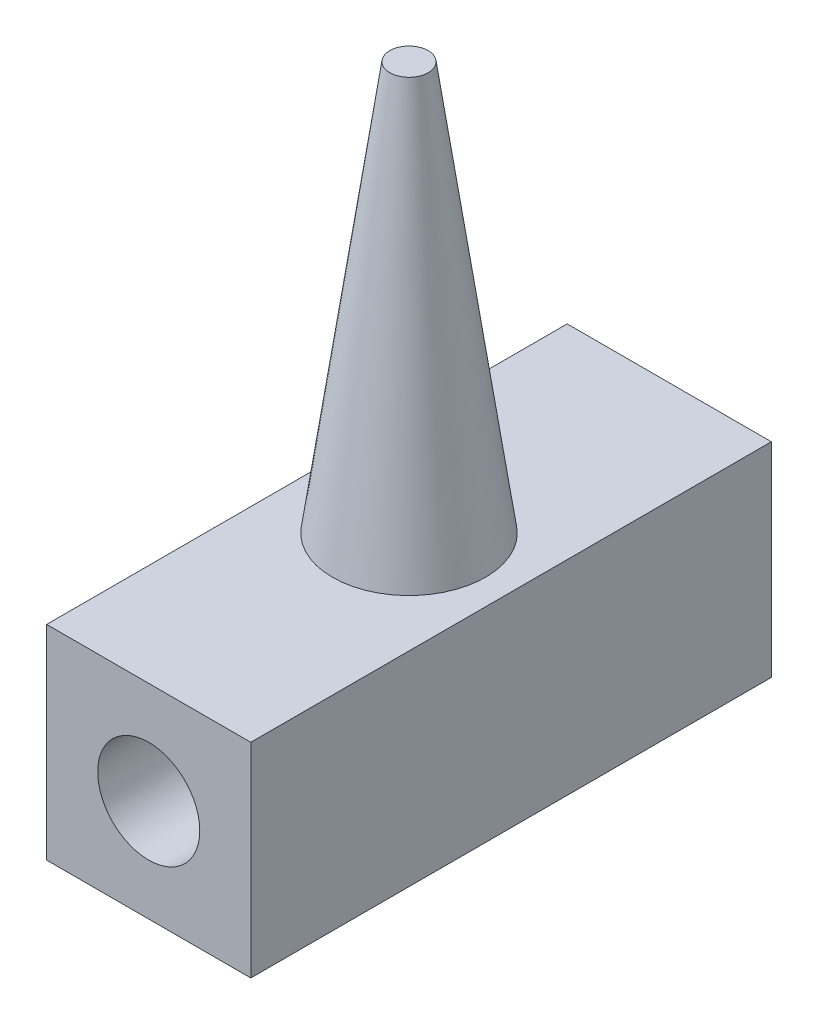
ISO-10303-21;
HEADER;
FILE_DESCRIPTION(('STEP AP214'),'2;1');
FILE_NAME('part.step','',(''),(''),'','','');
FILE_SCHEMA(('AUTOMOTIVE_DESIGN { 1 0 10303 214 1 1 1 1 }'));
ENDSEC;
DATA;
#1=APPLICATION_CONTEXT('core data for automotive mechanical design processes');
#2=APPLICATION_PROTOCOL_DEFINITION('international standard','automotive_design',2000,#1);
#3=PRODUCT_CONTEXT('',#1,'mechanical');
#4=PRODUCT('Part','Part','',(#3));
#5=PRODUCT_RELATED_PRODUCT_CATEGORY('part','',(#4));
#6=PRODUCT_DEFINITION_FORMATION('','',#4);
#7=PRODUCT_DEFINITION_CONTEXT('part definition',#1,'design');
#8=PRODUCT_DEFINITION('design','',#6,#7);
#9=PRODUCT_DEFINITION_SHAPE('','',#8);
#10=(LENGTH_UNIT() NAMED_UNIT(*) SI_UNIT(.MILLI.,.METRE.));
#11=(NAMED_UNIT(*) PLANE_ANGLE_UNIT() SI_UNIT($,.RADIAN.));
#12=(NAMED_UNIT(*) SI_UNIT($,.STERADIAN.) SOLID_ANGLE_UNIT());
#13=UNCERTAINTY_MEASURE_WITH_UNIT(LENGTH_MEASURE(1.E-05),#10,'distance_accuracy_value','');
#14=(GEOMETRIC_REPRESENTATION_CONTEXT(3) GLOBAL_UNCERTAINTY_ASSIGNED_CONTEXT((#13)) GLOBAL_UNIT_ASSIGNED_CONTEXT((#10,
#11,#12)) REPRESENTATION_CONTEXT('',''));
#15=CARTESIAN_POINT('',(0.,0.,0.));
#16=DIRECTION('',(0.,0.,1.));
#17=DIRECTION('',(1.,0.,0.));
#18=AXIS2_PLACEMENT_3D('',#15,#16,#17);
#19=CARTESIAN_POINT('',(-24.75,12.75,51.));
#20=DIRECTION('',(1.,0.,0.));
#21=DIRECTION('',(0.,0.,-1.));
#22=AXIS2_PLACEMENT_3D('',#19,#20,#21);
#23=PLANE('',#22);
#24=DIRECTION('',(0.,-1.,0.));
#25=VECTOR('',#24,1.);
#26=CARTESIAN_POINT('',(-24.75,12.75,0.));
#27=LINE('',#26,#25);
#28=CARTESIAN_POINT('',(-24.75,12.75,0.));
#29=VERTEX_POINT('',#28);
#30=CARTESIAN_POINT('',(-24.75,-7.25000000000001,0.));
#31=VERTEX_POINT('',#30);
#32=EDGE_CURVE('E110',#29,#31,#27,.T.);
#33=ORIENTED_EDGE('',*,*,#32,.T.);
#34=DIRECTION('',(0.,0.,-1.));
#35=VECTOR('',#34,1.);
#36=CARTESIAN_POINT('',(-24.75,-7.25000000000001,51.));
#37=LINE('',#36,#35);
#38=CARTESIAN_POINT('',(-24.75,-7.25000000000001,51.));
#39=VERTEX_POINT('',#38);
#40=EDGE_CURVE('E42',#39,#31,#37,.T.);
#41=ORIENTED_EDGE('',*,*,#40,.F.);
#42=DIRECTION('',(0.,-1.,0.));
#43=VECTOR('',#42,1.);
#44=CARTESIAN_POINT('',(-24.75,12.75,51.));
#45=LINE('',#44,#43);
#46=CARTESIAN_POINT('',(-24.75,12.75,51.));
#47=VERTEX_POINT('',#46);
#48=EDGE_CURVE('E93',#47,#39,#45,.T.);
#49=ORIENTED_EDGE('',*,*,#48,.F.);
#50=DIRECTION('',(0.,0.,-1.));
#51=VECTOR('',#50,1.);
#52=CARTESIAN_POINT('',(-24.75,12.75,51.));
#53=LINE('',#52,#51);
#54=EDGE_CURVE('E106',#47,#29,#53,.T.);
#55=ORIENTED_EDGE('',*,*,#54,.T.);
#56=EDGE_LOOP('',(#33,#41,#49,#55));
#57=FACE_BOUND('',#56,.T.);
#58=ADVANCED_FACE('F39',(#57),#23,.F.);
#59=CARTESIAN_POINT('',(-24.75,-7.25000000000001,51.));
#60=DIRECTION('',(0.,1.,0.));
#61=DIRECTION('',(0.,0.,1.));
#62=AXIS2_PLACEMENT_3D('',#59,#60,#61);
#63=PLANE('',#62);
#64=DIRECTION('',(1.,0.,0.));
#65=VECTOR('',#64,1.);
#66=CARTESIAN_POINT('',(-24.75,-7.25000000000001,0.));
#67=LINE('',#66,#65);
#68=CARTESIAN_POINT('',(-4.74999999999999,-7.25000000000001,0.));
#69=VERTEX_POINT('',#68);
#70=EDGE_CURVE('E99',#31,#69,#67,.T.);
#71=ORIENTED_EDGE('',*,*,#70,.T.);
#72=DIRECTION('',(0.,0.,-1.));
#73=VECTOR('',#72,1.);
#74=CARTESIAN_POINT('',(-4.74999999999999,-7.25000000000001,51.));
#75=LINE('',#74,#73);
#76=CARTESIAN_POINT('',(-4.74999999999999,-7.25000000000001,51.));
#77=VERTEX_POINT('',#76);
#78=EDGE_CURVE('E97',#77,#69,#75,.T.);
#79=ORIENTED_EDGE('',*,*,#78,.F.);
#80=DIRECTION('',(1.,0.,0.));
#81=VECTOR('',#80,1.);
#82=CARTESIAN_POINT('',(-24.75,-7.25000000000001,51.));
#83=LINE('',#82,#81);
#84=EDGE_CURVE('E88',#39,#77,#83,.T.);
#85=ORIENTED_EDGE('',*,*,#84,.F.);
#86=ORIENTED_EDGE('',*,*,#40,.T.);
#87=EDGE_LOOP('',(#71,#79,#85,#86));
#88=FACE_BOUND('',#87,.T.);
#89=ADVANCED_FACE('F98',(#88),#63,.F.);
#90=CARTESIAN_POINT('',(-4.75,12.75,51.));
#91=DIRECTION('',(-1.,0.,0.));
#92=DIRECTION('',(0.,-1.,0.));
#93=AXIS2_PLACEMENT_3D('',#90,#91,#92);
#94=PLANE('',#93);
#95=DIRECTION('',(0.,1.,0.));
#96=VECTOR('',#95,1.);
#97=CARTESIAN_POINT('',(-4.75,12.75,0.));
#98=LINE('',#97,#96);
#99=CARTESIAN_POINT('',(-4.75,12.75,0.));
#100=VERTEX_POINT('',#99);
#101=EDGE_CURVE('E74',#69,#100,#98,.T.);
#102=ORIENTED_EDGE('',*,*,#101,.T.);
#103=DIRECTION('',(0.,0.,-1.));
#104=VECTOR('',#103,1.);
#105=CARTESIAN_POINT('',(-4.75,12.75,51.));
#106=LINE('',#105,#104);
#107=CARTESIAN_POINT('',(-4.75,12.75,51.));
#108=VERTEX_POINT('',#107);
#109=EDGE_CURVE('E101',#108,#100,#106,.T.);
#110=ORIENTED_EDGE('',*,*,#109,.F.);
#111=DIRECTION('',(0.,1.,0.));
#112=VECTOR('',#111,1.);
#113=CARTESIAN_POINT('',(-4.75,12.75,51.));
#114=LINE('',#113,#112);
#115=EDGE_CURVE('E91',#77,#108,#114,.T.);
#116=ORIENTED_EDGE('',*,*,#115,.F.);
#117=ORIENTED_EDGE('',*,*,#78,.T.);
#118=EDGE_LOOP('',(#102,#110,#116,#117));
#119=FACE_BOUND('',#118,.T.);
#120=ADVANCED_FACE('F102',(#119),#94,.F.);
#121=CARTESIAN_POINT('',(-24.75,12.75,51.));
#122=DIRECTION('',(0.,-1.,0.));
#123=DIRECTION('',(0.,0.,-1.));
#124=AXIS2_PLACEMENT_3D('',#121,#122,#123);
#125=PLANE('',#124);
#126=CARTESIAN_POINT('',(-14.75,12.75,25.5));
#127=DIRECTION('',(0.,1.,0.));
#128=DIRECTION('',(0.,0.,1.));
#129=AXIS2_PLACEMENT_3D('',#126,#127,#128);
#130=CIRCLE('',#129,7.5);
#131=CARTESIAN_POINT('',(-14.75,12.75,33.));
#132=VERTEX_POINT('',#131);
#133=EDGE_CURVE('E11',#132,#132,#130,.T.);
#134=ORIENTED_EDGE('',*,*,#133,.F.);
#135=EDGE_LOOP('',(#134));
#136=FACE_BOUND('',#135,.T.);
#137=DIRECTION('',(-1.,0.,0.));
#138=VECTOR('',#137,1.);
#139=CARTESIAN_POINT('',(-24.75,12.75,0.));
#140=LINE('',#139,#138);
#141=EDGE_CURVE('E80',#100,#29,#140,.T.);
#142=ORIENTED_EDGE('',*,*,#141,.T.);
#143=ORIENTED_EDGE('',*,*,#54,.F.);
#144=DIRECTION('',(-1.,0.,0.));
#145=VECTOR('',#144,1.);
#146=CARTESIAN_POINT('',(-24.75,12.75,51.));
#147=LINE('',#146,#145);
#148=EDGE_CURVE('E57',#108,#47,#147,.T.);
#149=ORIENTED_EDGE('',*,*,#148,.F.);
#150=ORIENTED_EDGE('',*,*,#109,.T.);
#151=EDGE_LOOP('',(#142,#143,#149,#150));
#152=FACE_BOUND('',#151,.T.);
#153=ADVANCED_FACE('F124',(#136,#152),#125,.F.);
#154=CARTESIAN_POINT('',(0.,0.,51.));
#155=DIRECTION('',(0.,0.,1.));
#156=DIRECTION('',(1.,0.,0.));
#157=AXIS2_PLACEMENT_3D('',#154,#155,#156);
#158=PLANE('',#157);
#159=CARTESIAN_POINT('',(-14.75,2.74999999999999,51.));
#160=DIRECTION('',(0.,0.,1.));
#161=DIRECTION('',(1.,0.,0.));
#162=AXIS2_PLACEMENT_3D('',#159,#160,#161);
#163=CIRCLE('',#162,5.);
#164=CARTESIAN_POINT('',(-9.74999999999999,2.74999999999999,51.));
#165=VERTEX_POINT('',#164);
#166=EDGE_CURVE('E131',#165,#165,#163,.T.);
#167=ORIENTED_EDGE('',*,*,#166,.F.);
#168=EDGE_LOOP('',(#167));
#169=FACE_BOUND('',#168,.T.);
#170=ORIENTED_EDGE('',*,*,#48,.T.);
#171=ORIENTED_EDGE('',*,*,#84,.T.);
#172=ORIENTED_EDGE('',*,*,#115,.T.);
#173=ORIENTED_EDGE('',*,*,#148,.T.);
#174=EDGE_LOOP('',(#170,#171,#172,#173));
#175=FACE_BOUND('',#174,.T.);
#176=ADVANCED_FACE('F89',(#169,#175),#158,.T.);
#177=CARTESIAN_POINT('',(0.,0.,0.));
#178=DIRECTION('',(0.,0.,1.));
#179=DIRECTION('',(1.,0.,0.));
#180=AXIS2_PLACEMENT_3D('',#177,#178,#179);
#181=PLANE('',#180);
#182=CARTESIAN_POINT('',(-14.75,2.74999999999999,0.));
#183=DIRECTION('',(0.,0.,1.));
#184=DIRECTION('',(1.,0.,0.));
#185=AXIS2_PLACEMENT_3D('',#182,#183,#184);
#186=CIRCLE('',#185,5.);
#187=CARTESIAN_POINT('',(-9.74999999999999,2.74999999999999,0.));
#188=VERTEX_POINT('',#187);
#189=EDGE_CURVE('E114',#188,#188,#186,.T.);
#190=ORIENTED_EDGE('',*,*,#189,.T.);
#191=EDGE_LOOP('',(#190));
#192=FACE_BOUND('',#191,.T.);
#193=ORIENTED_EDGE('',*,*,#32,.F.);
#194=ORIENTED_EDGE('',*,*,#141,.F.);
#195=ORIENTED_EDGE('',*,*,#101,.F.);
#196=ORIENTED_EDGE('',*,*,#70,.F.);
#197=EDGE_LOOP('',(#193,#194,#195,#196));
#198=FACE_BOUND('',#197,.T.);
#199=ADVANCED_FACE('F127',(#192,#198),#181,.F.);
#200=CARTESIAN_POINT('',(-14.75,2.74999999999999,0.));
#201=DIRECTION('',(0.,0.,1.));
#202=DIRECTION('',(1.,0.,0.));
#203=AXIS2_PLACEMENT_3D('',#200,#201,#202);
#204=CYLINDRICAL_SURFACE('',#203,5.);
#205=ORIENTED_EDGE('',*,*,#189,.F.);
#206=EDGE_LOOP('',(#205));
#207=FACE_BOUND('',#206,.T.);
#208=ORIENTED_EDGE('',*,*,#166,.T.);
#209=EDGE_LOOP('',(#208));
#210=FACE_BOUND('',#209,.T.);
#211=ADVANCED_FACE('F148',(#207,#210),#204,.F.);
#212=CARTESIAN_POINT('',(-14.75,12.75,25.5));
#213=DIRECTION('',(0.,-1.,0.));
#214=DIRECTION('',(0.,0.,1.));
#215=AXIS2_PLACEMENT_3D('',#212,#213,#214);
#216=CONICAL_SURFACE('',#215,7.5,0.139626340159547);
#217=CARTESIAN_POINT('',(-14.75,52.75,25.5));
#218=DIRECTION('',(0.,1.,0.));
#219=DIRECTION('',(0.,0.,1.));
#220=AXIS2_PLACEMENT_3D('',#217,#218,#219);
#221=CIRCLE('',#220,1.87836661190433);
#222=CARTESIAN_POINT('',(-14.75,52.75,27.3783666119043));
#223=VERTEX_POINT('',#222);
#224=EDGE_CURVE('E135',#223,#223,#221,.T.);
#225=CARTESIAN_POINT('',(-14.75,52.75,27.3783666119043));
#226=CARTESIAN_POINT('',(-14.75,52.3333333333333,27.4369252930303));
#227=CARTESIAN_POINT('',(-14.75,51.9166666666667,27.4954839741563));
#228=CARTESIAN_POINT('',(-14.75,51.0833333333333,27.6126013364083));
#229=CARTESIAN_POINT('',(-14.75,50.6666666666667,27.6711600175343));
#230=CARTESIAN_POINT('',(-14.75,49.8333333333333,27.7882773797863));
#231=CARTESIAN_POINT('',(-14.75,49.4166666666667,27.8468360609123));
#232=CARTESIAN_POINT('',(-14.75,48.5833333333333,27.9639534231643));
#233=CARTESIAN_POINT('',(-14.75,48.1666666666667,28.0225121042903));
#234=CARTESIAN_POINT('',(-14.75,47.3333333333333,28.1396294665423));
#235=CARTESIAN_POINT('',(-14.75,46.9166666666667,28.1981881476683));
#236=CARTESIAN_POINT('',(-14.75,46.0833333333333,28.3153055099203));
#237=CARTESIAN_POINT('',(-14.75,45.6666666666667,28.3738641910463));
#238=CARTESIAN_POINT('',(-14.75,44.8333333333333,28.4909815532983));
#239=CARTESIAN_POINT('',(-14.75,44.4166666666667,28.5495402344243));
#240=CARTESIAN_POINT('',(-14.75,43.5833333333333,28.6666575966763));
#241=CARTESIAN_POINT('',(-14.75,43.1666666666667,28.7252162778023));
#242=CARTESIAN_POINT('',(-14.75,42.3333333333333,28.8423336400542));
#243=CARTESIAN_POINT('',(-14.75,41.9166666666667,28.9008923211803));
#244=CARTESIAN_POINT('',(-14.75,41.0833333333333,29.0180096834322));
#245=CARTESIAN_POINT('',(-14.75,40.6666666666667,29.0765683645582));
#246=CARTESIAN_POINT('',(-14.75,39.8333333333333,29.1936857268102));
#247=CARTESIAN_POINT('',(-14.75,39.4166666666667,29.2522444079362));
#248=CARTESIAN_POINT('',(-14.75,38.5833333333333,29.3693617701882));
#249=CARTESIAN_POINT('',(-14.75,38.1666666666667,29.4279204513142));
#250=CARTESIAN_POINT('',(-14.75,37.3333333333333,29.5450378135662));
#251=CARTESIAN_POINT('',(-14.75,36.9166666666667,29.6035964946922));
#252=CARTESIAN_POINT('',(-14.75,36.0833333333333,29.7207138569442));
#253=CARTESIAN_POINT('',(-14.75,35.6666666666667,29.7792725380702));
#254=CARTESIAN_POINT('',(-14.75,34.8333333333333,29.8963899003222));
#255=CARTESIAN_POINT('',(-14.75,34.4166666666667,29.9549485814482));
#256=CARTESIAN_POINT('',(-14.75,33.5833333333333,30.0720659437002));
#257=CARTESIAN_POINT('',(-14.75,33.1666666666667,30.1306246248262));
#258=CARTESIAN_POINT('',(-14.75,32.3333333333333,30.2477419870782));
#259=CARTESIAN_POINT('',(-14.75,31.9166666666667,30.3063006682042));
#260=CARTESIAN_POINT('',(-14.75,31.0833333333333,30.4234180304562));
#261=CARTESIAN_POINT('',(-14.75,30.6666666666667,30.4819767115822));
#262=CARTESIAN_POINT('',(-14.75,29.8333333333333,30.5990940738341));
#263=CARTESIAN_POINT('',(-14.75,29.4166666666667,30.6576527549601));
#264=CARTESIAN_POINT('',(-14.75,28.5833333333333,30.7747701172121));
#265=CARTESIAN_POINT('',(-14.75,28.1666666666667,30.8333287983381));
#266=CARTESIAN_POINT('',(-14.75,27.3333333333333,30.9504461605901));
#267=CARTESIAN_POINT('',(-14.75,26.9166666666667,31.0090048417161));
#268=CARTESIAN_POINT('',(-14.75,26.0833333333333,31.1261222039681));
#269=CARTESIAN_POINT('',(-14.75,25.6666666666667,31.1846808850941));
#270=CARTESIAN_POINT('',(-14.75,24.8333333333333,31.3017982473461));
#271=CARTESIAN_POINT('',(-14.75,24.4166666666667,31.3603569284721));
#272=CARTESIAN_POINT('',(-14.75,23.5833333333333,31.4774742907241));
#273=CARTESIAN_POINT('',(-14.75,23.1666666666667,31.5360329718501));
#274=CARTESIAN_POINT('',(-14.75,22.3333333333333,31.6531503341021));
#275=CARTESIAN_POINT('',(-14.75,21.9166666666667,31.7117090152281));
#276=CARTESIAN_POINT('',(-14.75,21.0833333333333,31.8288263774801));
#277=CARTESIAN_POINT('',(-14.75,20.6666666666667,31.8873850586061));
#278=CARTESIAN_POINT('',(-14.75,19.8333333333333,32.0045024208581));
#279=CARTESIAN_POINT('',(-14.75,19.4166666666667,32.0630611019841));
#280=CARTESIAN_POINT('',(-14.75,18.5833333333333,32.1801784642361));
#281=CARTESIAN_POINT('',(-14.75,18.1666666666667,32.2387371453621));
#282=CARTESIAN_POINT('',(-14.75,17.3333333333333,32.355854507614));
#283=CARTESIAN_POINT('',(-14.75,16.9166666666667,32.41441318874));
#284=CARTESIAN_POINT('',(-14.75,16.0833333333333,32.531530550992));
#285=CARTESIAN_POINT('',(-14.75,15.6666666666667,32.590089232118));
#286=CARTESIAN_POINT('',(-14.75,14.8333333333333,32.70720659437));
#287=CARTESIAN_POINT('',(-14.75,14.4166666666667,32.765765275496));
#288=CARTESIAN_POINT('',(-14.75,13.5833333333333,32.882882637748));
#289=CARTESIAN_POINT('',(-14.75,13.1666666666667,32.941441318874));
#290=CARTESIAN_POINT('',(-14.75,12.75,33.));
#291=B_SPLINE_CURVE_WITH_KNOTS('',3,(#225,#226,#227,#228,#229,#230,#231,#232,#233,#234,#235,
#236,#237,#238,#239,#240,#241,#242,#243,#244,#245,#246,#247,#248,#249,#250,#251,#252,#253,#254,
#255,#256,#257,#258,#259,#260,#261,#262,#263,#264,#265,#266,#267,#268,#269,#270,#271,#272,#273,
#274,#275,#276,#277,#278,#279,#280,#281,#282,#283,#284,#285,#286,#287,#288,#289,#290),
.UNSPECIFIED.,.F.,.F.,(4,2,2,2,2,2,2,2,2,2,2,2,2,2,2,2,2,2,2,2,2,2,2,2,2,2,2,2,2,2,2,2,4),(0.,
1.26228446564827,2.52456893129655,3.78685339694481,5.04913786259309,6.31142232824136,
7.57370679388964,8.83599125953791,10.0982757251862,11.3605601908345,12.6228446564827,
13.885129122131,15.1474135877793,16.4096980534275,17.6719825190758,18.9342669847241,
20.1965514503724,21.4588359160206,22.7211203816689,23.9834048473172,25.2456893129654,
26.5079737786137,27.770258244262,29.0325427099102,30.2948271755585,31.5571116412068,
32.8193961068551,34.0816805725033,35.3439650381516,36.6062495037999,37.8685339694482,
39.1308184350964,40.3931029007447),.UNSPECIFIED.);
#292=EDGE_CURVE('BSEAM145',#223,#132,#291,.T.);
#293=ORIENTED_EDGE('',*,*,#224,.F.);
#294=ORIENTED_EDGE('',*,*,#133,.T.);
#295=ORIENTED_EDGE('',*,*,#292,.T.);
#296=ORIENTED_EDGE('',*,*,#292,.F.);
#297=EDGE_LOOP('',(#293,#295,#294,#296));
#298=FACE_BOUND('',#297,.T.);
#299=ADVANCED_FACE('F145',(#298),#216,.T.);
#300=CARTESIAN_POINT('',(-14.75,52.75,25.5));
#301=DIRECTION('',(0.,1.,0.));
#302=DIRECTION('',(0.,0.,1.));
#303=AXIS2_PLACEMENT_3D('',#300,#301,#302);
#304=PLANE('',#303);
#305=ORIENTED_EDGE('',*,*,#224,.T.);
#306=EDGE_LOOP('',(#305));
#307=FACE_BOUND('',#306,.T.);
#308=ADVANCED_FACE('F143',(#307),#304,.T.);
#309=CLOSED_SHELL('',(#58,#89,#120,#153,#176,#199,#211,#299,#308));
#310=MANIFOLD_SOLID_BREP('B2',#309);
#311=ADVANCED_BREP_SHAPE_REPRESENTATION('',(#18,#310),#14);
#312=SHAPE_DEFINITION_REPRESENTATION(#9,#311);
ENDSEC;
END-ISO-10303-21;
